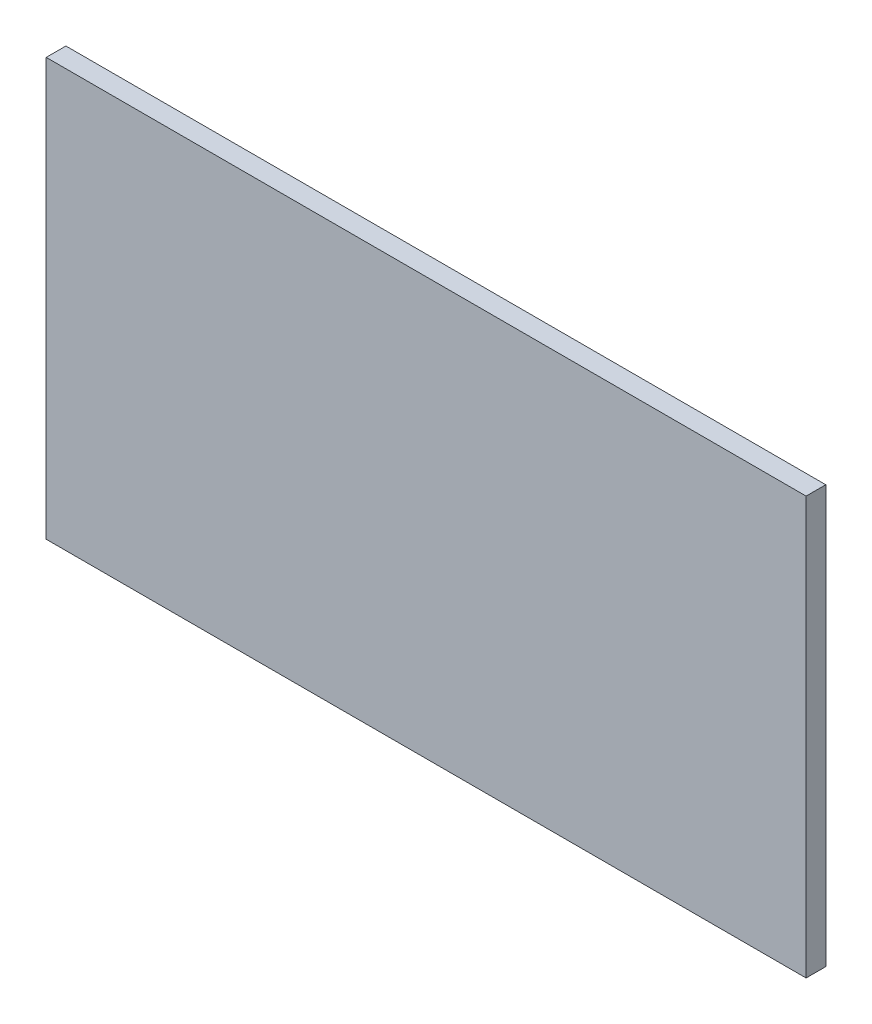
ISO-10303-21;
HEADER;
FILE_DESCRIPTION(('STEP AP214'),'2;1');
FILE_NAME('part.step','',(''),(''),'','','');
FILE_SCHEMA(('AUTOMOTIVE_DESIGN { 1 0 10303 214 1 1 1 1 }'));
ENDSEC;
DATA;
#1=APPLICATION_CONTEXT('core data for automotive mechanical design processes');
#2=APPLICATION_PROTOCOL_DEFINITION('international standard','automotive_design',2000,#1);
#3=PRODUCT_CONTEXT('',#1,'mechanical');
#4=PRODUCT('Part','Part','',(#3));
#5=PRODUCT_RELATED_PRODUCT_CATEGORY('part','',(#4));
#6=PRODUCT_DEFINITION_FORMATION('','',#4);
#7=PRODUCT_DEFINITION_CONTEXT('part definition',#1,'design');
#8=PRODUCT_DEFINITION('design','',#6,#7);
#9=PRODUCT_DEFINITION_SHAPE('','',#8);
#10=(LENGTH_UNIT() NAMED_UNIT(*) SI_UNIT(.MILLI.,.METRE.));
#11=(NAMED_UNIT(*) PLANE_ANGLE_UNIT() SI_UNIT($,.RADIAN.));
#12=(NAMED_UNIT(*) SI_UNIT($,.STERADIAN.) SOLID_ANGLE_UNIT());
#13=UNCERTAINTY_MEASURE_WITH_UNIT(LENGTH_MEASURE(1.E-05),#10,'distance_accuracy_value','');
#14=(GEOMETRIC_REPRESENTATION_CONTEXT(3) GLOBAL_UNCERTAINTY_ASSIGNED_CONTEXT((#13)) GLOBAL_UNIT_ASSIGNED_CONTEXT((#10,
#11,#12)) REPRESENTATION_CONTEXT('',''));
#15=CARTESIAN_POINT('',(0.,0.,0.));
#16=DIRECTION('',(0.,0.,1.));
#17=DIRECTION('',(1.,0.,0.));
#18=AXIS2_PLACEMENT_3D('',#15,#16,#17);
#19=CARTESIAN_POINT('',(0.,0.,15.));
#20=DIRECTION('',(1.,0.,0.));
#21=DIRECTION('',(0.,0.,-1.));
#22=AXIS2_PLACEMENT_3D('',#19,#20,#21);
#23=PLANE('',#22);
#24=DIRECTION('',(0.,-1.,0.));
#25=VECTOR('',#24,1.);
#26=CARTESIAN_POINT('',(0.,0.,0.));
#27=LINE('',#26,#25);
#28=CARTESIAN_POINT('',(0.,318.,0.));
#29=VERTEX_POINT('',#28);
#30=CARTESIAN_POINT('',(0.,0.,0.));
#31=VERTEX_POINT('',#30);
#32=EDGE_CURVE('E96',#29,#31,#27,.T.);
#33=ORIENTED_EDGE('',*,*,#32,.T.);
#34=DIRECTION('',(0.,0.,-1.));
#35=VECTOR('',#34,1.);
#36=CARTESIAN_POINT('',(0.,0.,15.));
#37=LINE('',#36,#35);
#38=CARTESIAN_POINT('',(0.,0.,15.));
#39=VERTEX_POINT('',#38);
#40=EDGE_CURVE('E11',#39,#31,#37,.T.);
#41=ORIENTED_EDGE('',*,*,#40,.F.);
#42=DIRECTION('',(0.,-1.,0.));
#43=VECTOR('',#42,1.);
#44=CARTESIAN_POINT('',(0.,0.,15.));
#45=LINE('',#44,#43);
#46=CARTESIAN_POINT('',(0.,318.,15.));
#47=VERTEX_POINT('',#46);
#48=EDGE_CURVE('E84',#47,#39,#45,.T.);
#49=ORIENTED_EDGE('',*,*,#48,.F.);
#50=DIRECTION('',(0.,0.,-1.));
#51=VECTOR('',#50,1.);
#52=CARTESIAN_POINT('',(0.,318.,15.));
#53=LINE('',#52,#51);
#54=EDGE_CURVE('E92',#47,#29,#53,.T.);
#55=ORIENTED_EDGE('',*,*,#54,.T.);
#56=EDGE_LOOP('',(#33,#41,#49,#55));
#57=FACE_BOUND('',#56,.T.);
#58=ADVANCED_FACE('F33',(#57),#23,.F.);
#59=CARTESIAN_POINT('',(0.,0.,15.));
#60=DIRECTION('',(0.,1.,0.));
#61=DIRECTION('',(0.,0.,1.));
#62=AXIS2_PLACEMENT_3D('',#59,#60,#61);
#63=PLANE('',#62);
#64=DIRECTION('',(1.,0.,0.));
#65=VECTOR('',#64,1.);
#66=CARTESIAN_POINT('',(0.,0.,0.));
#67=LINE('',#66,#65);
#68=CARTESIAN_POINT('',(579.,0.,0.));
#69=VERTEX_POINT('',#68);
#70=EDGE_CURVE('E88',#31,#69,#67,.T.);
#71=ORIENTED_EDGE('',*,*,#70,.T.);
#72=DIRECTION('',(0.,0.,-1.));
#73=VECTOR('',#72,1.);
#74=CARTESIAN_POINT('',(579.,0.,15.));
#75=LINE('',#74,#73);
#76=CARTESIAN_POINT('',(579.,0.,15.));
#77=VERTEX_POINT('',#76);
#78=EDGE_CURVE('E41',#77,#69,#75,.T.);
#79=ORIENTED_EDGE('',*,*,#78,.F.);
#80=DIRECTION('',(1.,0.,0.));
#81=VECTOR('',#80,1.);
#82=CARTESIAN_POINT('',(0.,0.,15.));
#83=LINE('',#82,#81);
#84=EDGE_CURVE('E79',#39,#77,#83,.T.);
#85=ORIENTED_EDGE('',*,*,#84,.F.);
#86=ORIENTED_EDGE('',*,*,#40,.T.);
#87=EDGE_LOOP('',(#71,#79,#85,#86));
#88=FACE_BOUND('',#87,.T.);
#89=ADVANCED_FACE('F87',(#88),#63,.F.);
#90=CARTESIAN_POINT('',(579.,0.,15.));
#91=DIRECTION('',(-1.,0.,0.));
#92=DIRECTION('',(0.,0.,1.));
#93=AXIS2_PLACEMENT_3D('',#90,#91,#92);
#94=PLANE('',#93);
#95=DIRECTION('',(0.,1.,0.));
#96=VECTOR('',#95,1.);
#97=CARTESIAN_POINT('',(579.,0.,0.));
#98=LINE('',#97,#96);
#99=CARTESIAN_POINT('',(579.,318.,0.));
#100=VERTEX_POINT('',#99);
#101=EDGE_CURVE('E66',#69,#100,#98,.T.);
#102=ORIENTED_EDGE('',*,*,#101,.T.);
#103=DIRECTION('',(0.,0.,-1.));
#104=VECTOR('',#103,1.);
#105=CARTESIAN_POINT('',(579.,318.,15.));
#106=LINE('',#105,#104);
#107=CARTESIAN_POINT('',(579.,318.,15.));
#108=VERTEX_POINT('',#107);
#109=EDGE_CURVE('E89',#108,#100,#106,.T.);
#110=ORIENTED_EDGE('',*,*,#109,.F.);
#111=DIRECTION('',(0.,1.,0.));
#112=VECTOR('',#111,1.);
#113=CARTESIAN_POINT('',(579.,0.,15.));
#114=LINE('',#113,#112);
#115=EDGE_CURVE('E82',#77,#108,#114,.T.);
#116=ORIENTED_EDGE('',*,*,#115,.F.);
#117=ORIENTED_EDGE('',*,*,#78,.T.);
#118=EDGE_LOOP('',(#102,#110,#116,#117));
#119=FACE_BOUND('',#118,.T.);
#120=ADVANCED_FACE('F90',(#119),#94,.F.);
#121=CARTESIAN_POINT('',(0.,318.,15.));
#122=DIRECTION('',(0.,-1.,0.));
#123=DIRECTION('',(0.,0.,-1.));
#124=AXIS2_PLACEMENT_3D('',#121,#122,#123);
#125=PLANE('',#124);
#126=DIRECTION('',(-1.,0.,0.));
#127=VECTOR('',#126,1.);
#128=CARTESIAN_POINT('',(0.,318.,0.));
#129=LINE('',#128,#127);
#130=EDGE_CURVE('E72',#100,#29,#129,.T.);
#131=ORIENTED_EDGE('',*,*,#130,.T.);
#132=ORIENTED_EDGE('',*,*,#54,.F.);
#133=DIRECTION('',(-1.,0.,0.));
#134=VECTOR('',#133,1.);
#135=CARTESIAN_POINT('',(0.,318.,15.));
#136=LINE('',#135,#134);
#137=EDGE_CURVE('E49',#108,#47,#136,.T.);
#138=ORIENTED_EDGE('',*,*,#137,.F.);
#139=ORIENTED_EDGE('',*,*,#109,.T.);
#140=EDGE_LOOP('',(#131,#132,#138,#139));
#141=FACE_BOUND('',#140,.T.);
#142=ADVANCED_FACE('F103',(#141),#125,.F.);
#143=CARTESIAN_POINT('',(0.,0.,15.));
#144=DIRECTION('',(0.,0.,-1.));
#145=DIRECTION('',(-1.,0.,0.));
#146=AXIS2_PLACEMENT_3D('',#143,#144,#145);
#147=PLANE('',#146);
#148=ORIENTED_EDGE('',*,*,#48,.T.);
#149=ORIENTED_EDGE('',*,*,#84,.T.);
#150=ORIENTED_EDGE('',*,*,#115,.T.);
#151=ORIENTED_EDGE('',*,*,#137,.T.);
#152=EDGE_LOOP('',(#148,#149,#150,#151));
#153=FACE_BOUND('',#152,.T.);
#154=ADVANCED_FACE('F80',(#153),#147,.F.);
#155=CARTESIAN_POINT('',(0.,0.,0.));
#156=DIRECTION('',(0.,0.,-1.));
#157=DIRECTION('',(-1.,0.,0.));
#158=AXIS2_PLACEMENT_3D('',#155,#156,#157);
#159=PLANE('',#158);
#160=ORIENTED_EDGE('',*,*,#32,.F.);
#161=ORIENTED_EDGE('',*,*,#130,.F.);
#162=ORIENTED_EDGE('',*,*,#101,.F.);
#163=ORIENTED_EDGE('',*,*,#70,.F.);
#164=EDGE_LOOP('',(#160,#161,#162,#163));
#165=FACE_BOUND('',#164,.T.);
#166=ADVANCED_FACE('F106',(#165),#159,.T.);
#167=CLOSED_SHELL('',(#58,#89,#120,#142,#154,#166));
#168=MANIFOLD_SOLID_BREP('B2',#167);
#169=ADVANCED_BREP_SHAPE_REPRESENTATION('',(#18,#168),#14);
#170=SHAPE_DEFINITION_REPRESENTATION(#9,#169);
ENDSEC;
END-ISO-10303-21;
